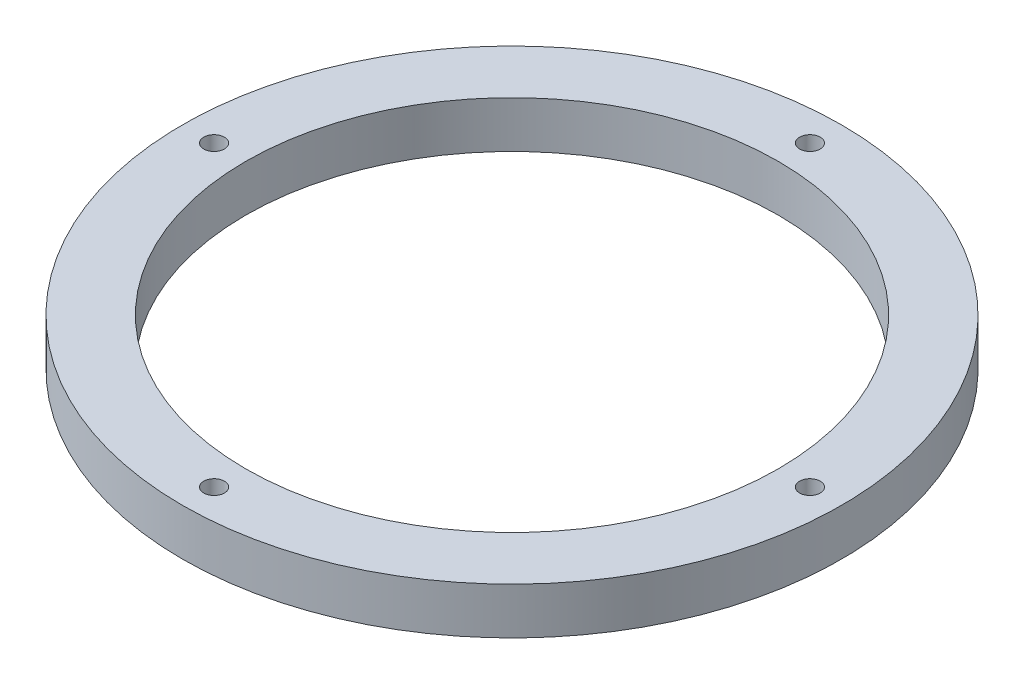
ISO-10303-21;
HEADER;
FILE_DESCRIPTION(('STEP AP214'),'2;1');
FILE_NAME('part.step','',(''),(''),'','','');
FILE_SCHEMA(('AUTOMOTIVE_DESIGN { 1 0 10303 214 1 1 1 1 }'));
ENDSEC;
DATA;
#1=APPLICATION_CONTEXT('core data for automotive mechanical design processes');
#2=APPLICATION_PROTOCOL_DEFINITION('international standard','automotive_design',2000,#1);
#3=PRODUCT_CONTEXT('',#1,'mechanical');
#4=PRODUCT('Part','Part','',(#3));
#5=PRODUCT_RELATED_PRODUCT_CATEGORY('part','',(#4));
#6=PRODUCT_DEFINITION_FORMATION('','',#4);
#7=PRODUCT_DEFINITION_CONTEXT('part definition',#1,'design');
#8=PRODUCT_DEFINITION('design','',#6,#7);
#9=PRODUCT_DEFINITION_SHAPE('','',#8);
#10=(LENGTH_UNIT() NAMED_UNIT(*) SI_UNIT(.MILLI.,.METRE.));
#11=(NAMED_UNIT(*) PLANE_ANGLE_UNIT() SI_UNIT($,.RADIAN.));
#12=(NAMED_UNIT(*) SI_UNIT($,.STERADIAN.) SOLID_ANGLE_UNIT());
#13=UNCERTAINTY_MEASURE_WITH_UNIT(LENGTH_MEASURE(1.E-05),#10,'distance_accuracy_value','');
#14=(GEOMETRIC_REPRESENTATION_CONTEXT(3) GLOBAL_UNCERTAINTY_ASSIGNED_CONTEXT((#13)) GLOBAL_UNIT_ASSIGNED_CONTEXT((#10,
#11,#12)) REPRESENTATION_CONTEXT('',''));
#15=CARTESIAN_POINT('',(0.,0.,0.));
#16=DIRECTION('',(0.,0.,1.));
#17=DIRECTION('',(1.,0.,0.));
#18=AXIS2_PLACEMENT_3D('',#15,#16,#17);
#19=CARTESIAN_POINT('',(0.,7.,0.));
#20=DIRECTION('',(0.,1.,0.));
#21=DIRECTION('',(0.,0.,1.));
#22=AXIS2_PLACEMENT_3D('',#19,#20,#21);
#23=PLANE('',#22);
#24=CARTESIAN_POINT('',(-4.68731369739691E-13,7.,44.75));
#25=DIRECTION('',(0.,1.,0.));
#26=DIRECTION('',(0.,0.,1.));
#27=AXIS2_PLACEMENT_3D('',#24,#25,#26);
#28=CIRCLE('',#27,1.55);
#29=CARTESIAN_POINT('',(-4.68731369739691E-13,7.,46.3));
#30=VERTEX_POINT('',#29);
#31=EDGE_CURVE('E71',#30,#30,#28,.T.);
#32=ORIENTED_EDGE('',*,*,#31,.F.);
#33=EDGE_LOOP('',(#32));
#34=FACE_BOUND('',#33,.T.);
#35=CARTESIAN_POINT('',(44.75,7.,3.12487579826461E-13));
#36=DIRECTION('',(0.,1.,0.));
#37=DIRECTION('',(0.,0.,1.));
#38=AXIS2_PLACEMENT_3D('',#35,#36,#37);
#39=CIRCLE('',#38,1.55);
#40=CARTESIAN_POINT('',(44.75,7.,1.55000000000031));
#41=VERTEX_POINT('',#40);
#42=EDGE_CURVE('E65',#41,#41,#39,.T.);
#43=ORIENTED_EDGE('',*,*,#42,.F.);
#44=EDGE_LOOP('',(#43));
#45=FACE_BOUND('',#44,.T.);
#46=CARTESIAN_POINT('',(1.5624378991323E-13,7.,-44.75));
#47=DIRECTION('',(0.,1.,0.));
#48=DIRECTION('',(0.,0.,1.));
#49=AXIS2_PLACEMENT_3D('',#46,#47,#48);
#50=CIRCLE('',#49,1.55);
#51=CARTESIAN_POINT('',(1.5624378991323E-13,7.,-43.2));
#52=VERTEX_POINT('',#51);
#53=EDGE_CURVE('E59',#52,#52,#50,.T.);
#54=ORIENTED_EDGE('',*,*,#53,.F.);
#55=EDGE_LOOP('',(#54));
#56=FACE_BOUND('',#55,.T.);
#57=CARTESIAN_POINT('',(-44.75,7.,0.));
#58=DIRECTION('',(0.,1.,0.));
#59=DIRECTION('',(0.,0.,1.));
#60=AXIS2_PLACEMENT_3D('',#57,#58,#59);
#61=CIRCLE('',#60,1.55);
#62=CARTESIAN_POINT('',(-44.75,7.,1.55));
#63=VERTEX_POINT('',#62);
#64=EDGE_CURVE('E53',#63,#63,#61,.T.);
#65=ORIENTED_EDGE('',*,*,#64,.F.);
#66=EDGE_LOOP('',(#65));
#67=FACE_BOUND('',#66,.T.);
#68=CARTESIAN_POINT('',(0.,7.,0.));
#69=DIRECTION('',(0.,1.,0.));
#70=DIRECTION('',(0.,0.,1.));
#71=AXIS2_PLACEMENT_3D('',#68,#69,#70);
#72=CIRCLE('',#71,49.5);
#73=CARTESIAN_POINT('',(0.,7.,49.5));
#74=VERTEX_POINT('',#73);
#75=EDGE_CURVE('E10',#74,#74,#72,.T.);
#76=ORIENTED_EDGE('',*,*,#75,.T.);
#77=EDGE_LOOP('',(#76));
#78=FACE_BOUND('',#77,.T.);
#79=CARTESIAN_POINT('',(0.,7.,0.));
#80=DIRECTION('',(0.,1.,0.));
#81=DIRECTION('',(0.,0.,1.));
#82=AXIS2_PLACEMENT_3D('',#79,#80,#81);
#83=CIRCLE('',#82,40.);
#84=CARTESIAN_POINT('',(0.,7.,40.));
#85=VERTEX_POINT('',#84);
#86=EDGE_CURVE('E45',#85,#85,#83,.T.);
#87=ORIENTED_EDGE('',*,*,#86,.F.);
#88=EDGE_LOOP('',(#87));
#89=FACE_BOUND('',#88,.T.);
#90=ADVANCED_FACE('F34',(#34,#45,#56,#67,#78,#89),#23,.T.);
#91=CARTESIAN_POINT('',(0.,0.,0.));
#92=DIRECTION('',(0.,1.,0.));
#93=DIRECTION('',(0.,0.,1.));
#94=AXIS2_PLACEMENT_3D('',#91,#92,#93);
#95=PLANE('',#94);
#96=CARTESIAN_POINT('',(-4.68731369739691E-13,0.,44.75));
#97=DIRECTION('',(0.,1.,0.));
#98=DIRECTION('',(0.,0.,1.));
#99=AXIS2_PLACEMENT_3D('',#96,#97,#98);
#100=CIRCLE('',#99,1.55);
#101=CARTESIAN_POINT('',(-4.68731369739691E-13,0.,46.3));
#102=VERTEX_POINT('',#101);
#103=EDGE_CURVE('E68',#102,#102,#100,.T.);
#104=ORIENTED_EDGE('',*,*,#103,.T.);
#105=EDGE_LOOP('',(#104));
#106=FACE_BOUND('',#105,.T.);
#107=CARTESIAN_POINT('',(44.75,0.,3.12487579826461E-13));
#108=DIRECTION('',(0.,1.,0.));
#109=DIRECTION('',(0.,0.,1.));
#110=AXIS2_PLACEMENT_3D('',#107,#108,#109);
#111=CIRCLE('',#110,1.55);
#112=CARTESIAN_POINT('',(44.75,0.,1.55000000000031));
#113=VERTEX_POINT('',#112);
#114=EDGE_CURVE('E62',#113,#113,#111,.T.);
#115=ORIENTED_EDGE('',*,*,#114,.T.);
#116=EDGE_LOOP('',(#115));
#117=FACE_BOUND('',#116,.T.);
#118=CARTESIAN_POINT('',(1.5624378991323E-13,0.,-44.75));
#119=DIRECTION('',(0.,1.,0.));
#120=DIRECTION('',(0.,0.,1.));
#121=AXIS2_PLACEMENT_3D('',#118,#119,#120);
#122=CIRCLE('',#121,1.55);
#123=CARTESIAN_POINT('',(1.5624378991323E-13,0.,-43.2));
#124=VERTEX_POINT('',#123);
#125=EDGE_CURVE('E56',#124,#124,#122,.T.);
#126=ORIENTED_EDGE('',*,*,#125,.T.);
#127=EDGE_LOOP('',(#126));
#128=FACE_BOUND('',#127,.T.);
#129=CARTESIAN_POINT('',(-44.75,0.,0.));
#130=DIRECTION('',(0.,1.,0.));
#131=DIRECTION('',(0.,0.,1.));
#132=AXIS2_PLACEMENT_3D('',#129,#130,#131);
#133=CIRCLE('',#132,1.55);
#134=CARTESIAN_POINT('',(-44.75,0.,1.55));
#135=VERTEX_POINT('',#134);
#136=EDGE_CURVE('E50',#135,#135,#133,.T.);
#137=ORIENTED_EDGE('',*,*,#136,.T.);
#138=EDGE_LOOP('',(#137));
#139=FACE_BOUND('',#138,.T.);
#140=CARTESIAN_POINT('',(0.,0.,0.));
#141=DIRECTION('',(0.,1.,0.));
#142=DIRECTION('',(0.,0.,1.));
#143=AXIS2_PLACEMENT_3D('',#140,#141,#142);
#144=CIRCLE('',#143,49.5);
#145=CARTESIAN_POINT('',(0.,0.,49.5));
#146=VERTEX_POINT('',#145);
#147=EDGE_CURVE('E38',#146,#146,#144,.T.);
#148=ORIENTED_EDGE('',*,*,#147,.F.);
#149=EDGE_LOOP('',(#148));
#150=FACE_BOUND('',#149,.T.);
#151=CARTESIAN_POINT('',(0.,0.,0.));
#152=DIRECTION('',(0.,1.,0.));
#153=DIRECTION('',(0.,0.,1.));
#154=AXIS2_PLACEMENT_3D('',#151,#152,#153);
#155=CIRCLE('',#154,40.);
#156=CARTESIAN_POINT('',(0.,0.,40.));
#157=VERTEX_POINT('',#156);
#158=EDGE_CURVE('E47',#157,#157,#155,.T.);
#159=ORIENTED_EDGE('',*,*,#158,.T.);
#160=EDGE_LOOP('',(#159));
#161=FACE_BOUND('',#160,.T.);
#162=ADVANCED_FACE('F77',(#106,#117,#128,#139,#150,#161),#95,.F.);
#163=CARTESIAN_POINT('',(0.,7.,0.));
#164=DIRECTION('',(0.,-1.,0.));
#165=DIRECTION('',(0.,0.,-1.));
#166=AXIS2_PLACEMENT_3D('',#163,#164,#165);
#167=CYLINDRICAL_SURFACE('',#166,49.5);
#168=ORIENTED_EDGE('',*,*,#75,.F.);
#169=EDGE_LOOP('',(#168));
#170=FACE_BOUND('',#169,.T.);
#171=ORIENTED_EDGE('',*,*,#147,.T.);
#172=EDGE_LOOP('',(#171));
#173=FACE_BOUND('',#172,.T.);
#174=ADVANCED_FACE('F36',(#170,#173),#167,.T.);
#175=CARTESIAN_POINT('',(0.,7.,0.));
#176=DIRECTION('',(0.,-1.,0.));
#177=DIRECTION('',(0.,0.,-1.));
#178=AXIS2_PLACEMENT_3D('',#175,#176,#177);
#179=CYLINDRICAL_SURFACE('',#178,40.);
#180=ORIENTED_EDGE('',*,*,#86,.T.);
#181=EDGE_LOOP('',(#180));
#182=FACE_BOUND('',#181,.T.);
#183=ORIENTED_EDGE('',*,*,#158,.F.);
#184=EDGE_LOOP('',(#183));
#185=FACE_BOUND('',#184,.T.);
#186=ADVANCED_FACE('F98',(#182,#185),#179,.F.);
#187=CARTESIAN_POINT('',(-44.75,0.,0.));
#188=DIRECTION('',(0.,1.,0.));
#189=DIRECTION('',(0.,0.,1.));
#190=AXIS2_PLACEMENT_3D('',#187,#188,#189);
#191=CYLINDRICAL_SURFACE('',#190,1.55);
#192=ORIENTED_EDGE('',*,*,#136,.F.);
#193=EDGE_LOOP('',(#192));
#194=FACE_BOUND('',#193,.T.);
#195=ORIENTED_EDGE('',*,*,#64,.T.);
#196=EDGE_LOOP('',(#195));
#197=FACE_BOUND('',#196,.T.);
#198=ADVANCED_FACE('F101',(#194,#197),#191,.F.);
#199=CARTESIAN_POINT('',(1.5624378991323E-13,0.,-44.75));
#200=DIRECTION('',(0.,1.,0.));
#201=DIRECTION('',(0.,0.,1.));
#202=AXIS2_PLACEMENT_3D('',#199,#200,#201);
#203=CYLINDRICAL_SURFACE('',#202,1.55);
#204=ORIENTED_EDGE('',*,*,#125,.F.);
#205=EDGE_LOOP('',(#204));
#206=FACE_BOUND('',#205,.T.);
#207=ORIENTED_EDGE('',*,*,#53,.T.);
#208=EDGE_LOOP('',(#207));
#209=FACE_BOUND('',#208,.T.);
#210=ADVANCED_FACE('F113',(#206,#209),#203,.F.);
#211=CARTESIAN_POINT('',(44.75,0.,3.12487579826461E-13));
#212=DIRECTION('',(0.,1.,0.));
#213=DIRECTION('',(0.,0.,1.));
#214=AXIS2_PLACEMENT_3D('',#211,#212,#213);
#215=CYLINDRICAL_SURFACE('',#214,1.55);
#216=ORIENTED_EDGE('',*,*,#114,.F.);
#217=EDGE_LOOP('',(#216));
#218=FACE_BOUND('',#217,.T.);
#219=ORIENTED_EDGE('',*,*,#42,.T.);
#220=EDGE_LOOP('',(#219));
#221=FACE_BOUND('',#220,.T.);
#222=ADVANCED_FACE('F83',(#218,#221),#215,.F.);
#223=CARTESIAN_POINT('',(-4.68731369739691E-13,0.,44.75));
#224=DIRECTION('',(0.,1.,0.));
#225=DIRECTION('',(0.,0.,1.));
#226=AXIS2_PLACEMENT_3D('',#223,#224,#225);
#227=CYLINDRICAL_SURFACE('',#226,1.55);
#228=ORIENTED_EDGE('',*,*,#103,.F.);
#229=EDGE_LOOP('',(#228));
#230=FACE_BOUND('',#229,.T.);
#231=ORIENTED_EDGE('',*,*,#31,.T.);
#232=EDGE_LOOP('',(#231));
#233=FACE_BOUND('',#232,.T.);
#234=ADVANCED_FACE('F80',(#230,#233),#227,.F.);
#235=CLOSED_SHELL('',(#90,#162,#174,#186,#198,#210,#222,#234));
#236=MANIFOLD_SOLID_BREP('B2',#235);
#237=ADVANCED_BREP_SHAPE_REPRESENTATION('',(#18,#236),#14);
#238=SHAPE_DEFINITION_REPRESENTATION(#9,#237);
ENDSEC;
END-ISO-10303-21;
